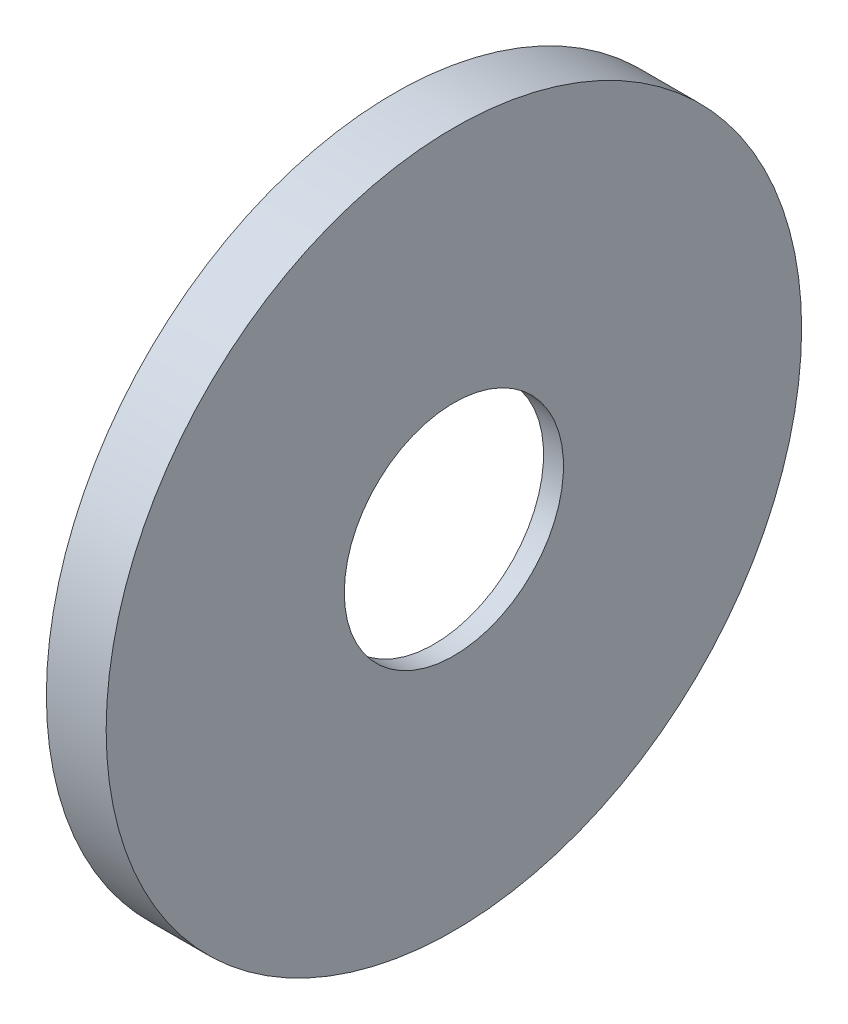
ISO-10303-21;
HEADER;
FILE_DESCRIPTION(('STEP AP214'),'2;1');
FILE_NAME('part.step','',(''),(''),'','','');
FILE_SCHEMA(('AUTOMOTIVE_DESIGN { 1 0 10303 214 1 1 1 1 }'));
ENDSEC;
DATA;
#1=APPLICATION_CONTEXT('core data for automotive mechanical design processes');
#2=APPLICATION_PROTOCOL_DEFINITION('international standard','automotive_design',2000,#1);
#3=PRODUCT_CONTEXT('',#1,'mechanical');
#4=PRODUCT('Part','Part','',(#3));
#5=PRODUCT_RELATED_PRODUCT_CATEGORY('part','',(#4));
#6=PRODUCT_DEFINITION_FORMATION('','',#4);
#7=PRODUCT_DEFINITION_CONTEXT('part definition',#1,'design');
#8=PRODUCT_DEFINITION('design','',#6,#7);
#9=PRODUCT_DEFINITION_SHAPE('','',#8);
#10=(LENGTH_UNIT() NAMED_UNIT(*) SI_UNIT(.MILLI.,.METRE.));
#11=(NAMED_UNIT(*) PLANE_ANGLE_UNIT() SI_UNIT($,.RADIAN.));
#12=(NAMED_UNIT(*) SI_UNIT($,.STERADIAN.) SOLID_ANGLE_UNIT());
#13=UNCERTAINTY_MEASURE_WITH_UNIT(LENGTH_MEASURE(1.E-05),#10,'distance_accuracy_value','');
#14=(GEOMETRIC_REPRESENTATION_CONTEXT(3) GLOBAL_UNCERTAINTY_ASSIGNED_CONTEXT((#13)) GLOBAL_UNIT_ASSIGNED_CONTEXT((#10,
#11,#12)) REPRESENTATION_CONTEXT('',''));
#15=CARTESIAN_POINT('',(0.,0.,0.));
#16=DIRECTION('',(0.,0.,1.));
#17=DIRECTION('',(1.,0.,0.));
#18=AXIS2_PLACEMENT_3D('',#15,#16,#17);
#19=CARTESIAN_POINT('',(0.,0.,0.));
#20=DIRECTION('',(-1.,0.,0.));
#21=DIRECTION('',(0.,0.,1.));
#22=AXIS2_PLACEMENT_3D('',#19,#20,#21);
#23=PLANE('',#22);
#24=CARTESIAN_POINT('',(0.,0.,0.));
#25=DIRECTION('',(-1.,0.,0.));
#26=DIRECTION('',(0.,0.,1.));
#27=AXIS2_PLACEMENT_3D('',#24,#25,#26);
#28=CIRCLE('',#27,15.);
#29=CARTESIAN_POINT('',(0.,0.,15.));
#30=VERTEX_POINT('',#29);
#31=EDGE_CURVE('E66',#30,#30,#28,.T.);
#32=ORIENTED_EDGE('',*,*,#31,.F.);
#33=EDGE_LOOP('',(#32));
#34=FACE_BOUND('',#33,.T.);
#35=CARTESIAN_POINT('',(0.,0.,0.));
#36=DIRECTION('',(-1.,0.,0.));
#37=DIRECTION('',(0.,0.,1.));
#38=AXIS2_PLACEMENT_3D('',#35,#36,#37);
#39=CIRCLE('',#38,17.45);
#40=CARTESIAN_POINT('',(0.,0.,-17.45));
#41=VERTEX_POINT('',#40);
#42=EDGE_CURVE('E83',#41,#41,#39,.T.);
#43=ORIENTED_EDGE('',*,*,#42,.T.);
#44=EDGE_LOOP('',(#43));
#45=FACE_BOUND('',#44,.T.);
#46=ADVANCED_FACE('F17',(#34,#45),#23,.T.);
#47=CARTESIAN_POINT('',(3.,0.,0.));
#48=DIRECTION('',(1.,0.,0.));
#49=DIRECTION('',(0.,1.,0.));
#50=AXIS2_PLACEMENT_3D('',#47,#48,#49);
#51=PLANE('',#50);
#52=CARTESIAN_POINT('',(3.,0.,0.));
#53=DIRECTION('',(1.,0.,0.));
#54=DIRECTION('',(0.,0.,-1.));
#55=AXIS2_PLACEMENT_3D('',#52,#53,#54);
#56=CIRCLE('',#55,5.5);
#57=CARTESIAN_POINT('',(3.,0.,5.5));
#58=VERTEX_POINT('',#57);
#59=EDGE_CURVE('E81',#58,#58,#56,.T.);
#60=ORIENTED_EDGE('',*,*,#59,.F.);
#61=EDGE_LOOP('',(#60));
#62=FACE_BOUND('',#61,.T.);
#63=CARTESIAN_POINT('',(3.,0.,0.));
#64=DIRECTION('',(1.,0.,0.));
#65=DIRECTION('',(0.,0.,-1.));
#66=AXIS2_PLACEMENT_3D('',#63,#64,#65);
#67=CIRCLE('',#66,17.45);
#68=CARTESIAN_POINT('',(3.,0.,-17.45));
#69=VERTEX_POINT('',#68);
#70=EDGE_CURVE('E11',#69,#69,#67,.T.);
#71=ORIENTED_EDGE('',*,*,#70,.T.);
#72=EDGE_LOOP('',(#71));
#73=FACE_BOUND('',#72,.T.);
#74=ADVANCED_FACE('F19',(#62,#73),#51,.T.);
#75=CARTESIAN_POINT('',(2.,0.,0.));
#76=DIRECTION('',(1.,0.,0.));
#77=DIRECTION('',(0.,1.,0.));
#78=AXIS2_PLACEMENT_3D('',#75,#76,#77);
#79=PLANE('',#78);
#80=CARTESIAN_POINT('',(2.,0.,0.));
#81=DIRECTION('',(1.,0.,0.));
#82=DIRECTION('',(0.,0.,-1.));
#83=AXIS2_PLACEMENT_3D('',#80,#81,#82);
#84=CIRCLE('',#83,5.5);
#85=CARTESIAN_POINT('',(2.,0.,5.5));
#86=VERTEX_POINT('',#85);
#87=EDGE_CURVE('E74',#86,#86,#84,.T.);
#88=ORIENTED_EDGE('',*,*,#87,.T.);
#89=EDGE_LOOP('',(#88));
#90=FACE_BOUND('',#89,.T.);
#91=CARTESIAN_POINT('',(2.,0.,0.));
#92=DIRECTION('',(-1.,0.,0.));
#93=DIRECTION('',(0.,0.,1.));
#94=AXIS2_PLACEMENT_3D('',#91,#92,#93);
#95=CIRCLE('',#94,15.);
#96=CARTESIAN_POINT('',(2.,0.,15.));
#97=VERTEX_POINT('',#96);
#98=EDGE_CURVE('E67',#97,#97,#95,.T.);
#99=ORIENTED_EDGE('',*,*,#98,.T.);
#100=EDGE_LOOP('',(#99));
#101=FACE_BOUND('',#100,.T.);
#102=ADVANCED_FACE('F94',(#90,#101),#79,.F.);
#103=CARTESIAN_POINT('',(3.,0.,0.));
#104=DIRECTION('',(-1.,0.,0.));
#105=DIRECTION('',(0.,0.,1.));
#106=AXIS2_PLACEMENT_3D('',#103,#104,#105);
#107=CYLINDRICAL_SURFACE('',#106,17.45);
#108=ORIENTED_EDGE('',*,*,#42,.F.);
#109=DIRECTION('',(1.,0.,0.));
#110=VECTOR('',#109,1.);
#111=CARTESIAN_POINT('',(3.,0.,-17.45));
#112=LINE('',#111,#110);
#113=EDGE_CURVE('E26',#41,#69,#112,.T.);
#114=ORIENTED_EDGE('',*,*,#113,.T.);
#115=ORIENTED_EDGE('',*,*,#70,.F.);
#116=ORIENTED_EDGE('',*,*,#113,.F.);
#117=EDGE_LOOP('',(#108,#114,#115,#116));
#118=FACE_BOUND('',#117,.T.);
#119=ADVANCED_FACE('F91',(#118),#107,.T.);
#120=CARTESIAN_POINT('',(2.,0.,0.));
#121=DIRECTION('',(1.,0.,0.));
#122=DIRECTION('',(0.,0.,-1.));
#123=AXIS2_PLACEMENT_3D('',#120,#121,#122);
#124=CYLINDRICAL_SURFACE('',#123,5.5);
#125=ORIENTED_EDGE('',*,*,#87,.F.);
#126=DIRECTION('',(1.,0.,0.));
#127=VECTOR('',#126,1.);
#128=CARTESIAN_POINT('',(2.,0.,5.5));
#129=LINE('',#128,#127);
#130=EDGE_CURVE('E80',#86,#58,#129,.T.);
#131=ORIENTED_EDGE('',*,*,#130,.T.);
#132=ORIENTED_EDGE('',*,*,#59,.T.);
#133=ORIENTED_EDGE('',*,*,#130,.F.);
#134=EDGE_LOOP('',(#125,#131,#132,#133));
#135=FACE_BOUND('',#134,.T.);
#136=ADVANCED_FACE('F93',(#135),#124,.F.);
#137=CARTESIAN_POINT('',(0.,0.,0.));
#138=DIRECTION('',(1.,0.,0.));
#139=DIRECTION('',(0.,0.,-1.));
#140=AXIS2_PLACEMENT_3D('',#137,#138,#139);
#141=CYLINDRICAL_SURFACE('',#140,15.);
#142=ORIENTED_EDGE('',*,*,#31,.T.);
#143=DIRECTION('',(1.,0.,0.));
#144=VECTOR('',#143,1.);
#145=CARTESIAN_POINT('',(0.,0.,15.));
#146=LINE('',#145,#144);
#147=EDGE_CURVE('E63',#30,#97,#146,.T.);
#148=ORIENTED_EDGE('',*,*,#147,.T.);
#149=ORIENTED_EDGE('',*,*,#98,.F.);
#150=ORIENTED_EDGE('',*,*,#147,.F.);
#151=EDGE_LOOP('',(#142,#148,#149,#150));
#152=FACE_BOUND('',#151,.T.);
#153=ADVANCED_FACE('F64',(#152),#141,.F.);
#154=CLOSED_SHELL('',(#46,#74,#102,#119,#136,#153));
#155=MANIFOLD_SOLID_BREP('B1',#154);
#156=ADVANCED_BREP_SHAPE_REPRESENTATION('',(#18,#155),#14);
#157=SHAPE_DEFINITION_REPRESENTATION(#9,#156);
ENDSEC;
END-ISO-10303-21;
